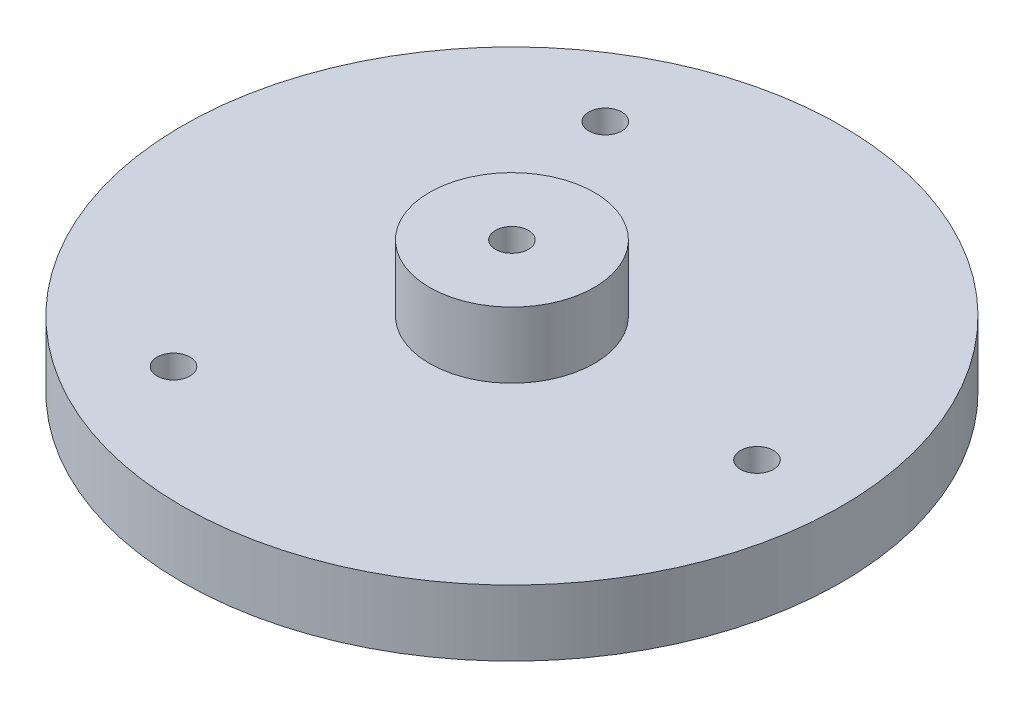
ISO-10303-21;
HEADER;
FILE_DESCRIPTION(('STEP AP214'),'2;1');
FILE_NAME('part.step','',(''),(''),'','','');
FILE_SCHEMA(('AUTOMOTIVE_DESIGN { 1 0 10303 214 1 1 1 1 }'));
ENDSEC;
DATA;
#1=APPLICATION_CONTEXT('core data for automotive mechanical design processes');
#2=APPLICATION_PROTOCOL_DEFINITION('international standard','automotive_design',2000,#1);
#3=PRODUCT_CONTEXT('',#1,'mechanical');
#4=PRODUCT('Part','Part','',(#3));
#5=PRODUCT_RELATED_PRODUCT_CATEGORY('part','',(#4));
#6=PRODUCT_DEFINITION_FORMATION('','',#4);
#7=PRODUCT_DEFINITION_CONTEXT('part definition',#1,'design');
#8=PRODUCT_DEFINITION('design','',#6,#7);
#9=PRODUCT_DEFINITION_SHAPE('','',#8);
#10=(LENGTH_UNIT() NAMED_UNIT(*) SI_UNIT(.MILLI.,.METRE.));
#11=(NAMED_UNIT(*) PLANE_ANGLE_UNIT() SI_UNIT($,.RADIAN.));
#12=(NAMED_UNIT(*) SI_UNIT($,.STERADIAN.) SOLID_ANGLE_UNIT());
#13=UNCERTAINTY_MEASURE_WITH_UNIT(LENGTH_MEASURE(1.E-05),#10,'distance_accuracy_value','');
#14=(GEOMETRIC_REPRESENTATION_CONTEXT(3) GLOBAL_UNCERTAINTY_ASSIGNED_CONTEXT((#13)) GLOBAL_UNIT_ASSIGNED_CONTEXT((#10,
#11,#12)) REPRESENTATION_CONTEXT('',''));
#15=CARTESIAN_POINT('',(0.,0.,0.));
#16=DIRECTION('',(0.,0.,1.));
#17=DIRECTION('',(1.,0.,0.));
#18=AXIS2_PLACEMENT_3D('',#15,#16,#17);
#19=CARTESIAN_POINT('',(0.,20.,0.));
#20=DIRECTION('',(0.,-1.,0.));
#21=DIRECTION('',(0.,0.,-1.));
#22=AXIS2_PLACEMENT_3D('',#19,#20,#21);
#23=CYLINDRICAL_SURFACE('',#22,100.);
#24=CARTESIAN_POINT('',(0.,20.,0.));
#25=DIRECTION('',(0.,1.,0.));
#26=DIRECTION('',(0.,0.,1.));
#27=AXIS2_PLACEMENT_3D('',#24,#25,#26);
#28=CIRCLE('',#27,100.);
#29=CARTESIAN_POINT('',(0.,20.,100.));
#30=VERTEX_POINT('',#29);
#31=EDGE_CURVE('E44',#30,#30,#28,.T.);
#32=ORIENTED_EDGE('',*,*,#31,.F.);
#33=EDGE_LOOP('',(#32));
#34=FACE_BOUND('',#33,.T.);
#35=CARTESIAN_POINT('',(0.,0.,0.));
#36=DIRECTION('',(0.,1.,0.));
#37=DIRECTION('',(0.,0.,1.));
#38=AXIS2_PLACEMENT_3D('',#35,#36,#37);
#39=CIRCLE('',#38,100.);
#40=CARTESIAN_POINT('',(0.,0.,100.));
#41=VERTEX_POINT('',#40);
#42=EDGE_CURVE('E40',#41,#41,#39,.T.);
#43=ORIENTED_EDGE('',*,*,#42,.T.);
#44=EDGE_LOOP('',(#43));
#45=FACE_BOUND('',#44,.T.);
#46=ADVANCED_FACE('F36',(#34,#45),#23,.T.);
#47=CARTESIAN_POINT('',(-38.0555535784994,20.,64.6279725957233));
#48=DIRECTION('',(0.,-1.,0.));
#49=DIRECTION('',(0.,0.,-1.));
#50=AXIS2_PLACEMENT_3D('',#47,#48,#49);
#51=CYLINDRICAL_SURFACE('',#50,5.00000000000475);
#52=CARTESIAN_POINT('',(-38.0555535784994,20.,64.6279725957233));
#53=DIRECTION('',(0.,1.,0.));
#54=DIRECTION('',(0.,0.,1.));
#55=AXIS2_PLACEMENT_3D('',#52,#53,#54);
#56=CIRCLE('',#55,5.00000000000475);
#57=CARTESIAN_POINT('',(-38.0555535784994,20.,69.6279725957281));
#58=VERTEX_POINT('',#57);
#59=EDGE_CURVE('E49',#58,#58,#56,.T.);
#60=ORIENTED_EDGE('',*,*,#59,.T.);
#61=EDGE_LOOP('',(#60));
#62=FACE_BOUND('',#61,.T.);
#63=CARTESIAN_POINT('',(-38.0555535784994,0.,64.6279725957233));
#64=DIRECTION('',(0.,1.,0.));
#65=DIRECTION('',(0.,0.,1.));
#66=AXIS2_PLACEMENT_3D('',#63,#64,#65);
#67=CIRCLE('',#66,5.00000000000475);
#68=CARTESIAN_POINT('',(-38.0555535784994,0.,69.6279725957281));
#69=VERTEX_POINT('',#68);
#70=EDGE_CURVE('E59',#69,#69,#67,.T.);
#71=ORIENTED_EDGE('',*,*,#70,.F.);
#72=EDGE_LOOP('',(#71));
#73=FACE_BOUND('',#72,.T.);
#74=ADVANCED_FACE('F80',(#62,#73),#51,.F.);
#75=CARTESIAN_POINT('',(74.997242852236,20.,0.643089856198714));
#76=DIRECTION('',(0.,-1.,0.));
#77=DIRECTION('',(0.,0.,-1.));
#78=AXIS2_PLACEMENT_3D('',#75,#76,#77);
#79=CYLINDRICAL_SURFACE('',#78,5.00000000000553);
#80=CARTESIAN_POINT('',(74.997242852236,20.,0.643089856198714));
#81=DIRECTION('',(0.,1.,0.));
#82=DIRECTION('',(0.,0.,1.));
#83=AXIS2_PLACEMENT_3D('',#80,#81,#82);
#84=CIRCLE('',#83,5.00000000000553);
#85=CARTESIAN_POINT('',(74.997242852236,20.,5.64308985620424));
#86=VERTEX_POINT('',#85);
#87=EDGE_CURVE('E68',#86,#86,#84,.T.);
#88=ORIENTED_EDGE('',*,*,#87,.T.);
#89=EDGE_LOOP('',(#88));
#90=FACE_BOUND('',#89,.T.);
#91=CARTESIAN_POINT('',(74.997242852236,0.,0.643089856198714));
#92=DIRECTION('',(0.,1.,0.));
#93=DIRECTION('',(0.,0.,1.));
#94=AXIS2_PLACEMENT_3D('',#91,#92,#93);
#95=CIRCLE('',#94,5.00000000000553);
#96=CARTESIAN_POINT('',(74.997242852236,0.,5.64308985620424));
#97=VERTEX_POINT('',#96);
#98=EDGE_CURVE('E56',#97,#97,#95,.T.);
#99=ORIENTED_EDGE('',*,*,#98,.F.);
#100=EDGE_LOOP('',(#99));
#101=FACE_BOUND('',#100,.T.);
#102=ADVANCED_FACE('F97',(#90,#101),#79,.F.);
#103=CARTESIAN_POINT('',(-36.9416892737284,20.,-65.2710624519266));
#104=DIRECTION('',(0.,-1.,0.));
#105=DIRECTION('',(0.,0.,-1.));
#106=AXIS2_PLACEMENT_3D('',#103,#104,#105);
#107=CYLINDRICAL_SURFACE('',#106,5.);
#108=CARTESIAN_POINT('',(-36.9416892737284,20.,-65.2710624519266));
#109=DIRECTION('',(0.,1.,0.));
#110=DIRECTION('',(0.,0.,1.));
#111=AXIS2_PLACEMENT_3D('',#108,#109,#110);
#112=CIRCLE('',#111,5.);
#113=CARTESIAN_POINT('',(-36.9416892737284,20.,-60.2710624519266));
#114=VERTEX_POINT('',#113);
#115=EDGE_CURVE('E64',#114,#114,#112,.T.);
#116=ORIENTED_EDGE('',*,*,#115,.T.);
#117=EDGE_LOOP('',(#116));
#118=FACE_BOUND('',#117,.T.);
#119=CARTESIAN_POINT('',(-36.9416892737284,0.,-65.2710624519266));
#120=DIRECTION('',(0.,1.,0.));
#121=DIRECTION('',(0.,0.,1.));
#122=AXIS2_PLACEMENT_3D('',#119,#120,#121);
#123=CIRCLE('',#122,5.);
#124=CARTESIAN_POINT('',(-36.9416892737284,0.,-60.2710624519266));
#125=VERTEX_POINT('',#124);
#126=EDGE_CURVE('E53',#125,#125,#123,.T.);
#127=ORIENTED_EDGE('',*,*,#126,.F.);
#128=EDGE_LOOP('',(#127));
#129=FACE_BOUND('',#128,.T.);
#130=ADVANCED_FACE('F38',(#118,#129),#107,.F.);
#131=CARTESIAN_POINT('',(0.,20.,0.));
#132=DIRECTION('',(0.,1.,0.));
#133=DIRECTION('',(0.,0.,1.));
#134=AXIS2_PLACEMENT_3D('',#131,#132,#133);
#135=PLANE('',#134);
#136=ORIENTED_EDGE('',*,*,#115,.F.);
#137=EDGE_LOOP('',(#136));
#138=FACE_BOUND('',#137,.T.);
#139=ORIENTED_EDGE('',*,*,#87,.F.);
#140=EDGE_LOOP('',(#139));
#141=FACE_BOUND('',#140,.T.);
#142=ORIENTED_EDGE('',*,*,#59,.F.);
#143=EDGE_LOOP('',(#142));
#144=FACE_BOUND('',#143,.T.);
#145=ORIENTED_EDGE('',*,*,#31,.T.);
#146=EDGE_LOOP('',(#145));
#147=FACE_BOUND('',#146,.T.);
#148=CARTESIAN_POINT('',(0.,20.,0.));
#149=DIRECTION('',(0.,1.,0.));
#150=DIRECTION('',(0.,0.,1.));
#151=AXIS2_PLACEMENT_3D('',#148,#149,#150);
#152=CIRCLE('',#151,25.);
#153=CARTESIAN_POINT('',(0.,20.,25.));
#154=VERTEX_POINT('',#153);
#155=EDGE_CURVE('E10',#154,#154,#152,.T.);
#156=ORIENTED_EDGE('',*,*,#155,.F.);
#157=EDGE_LOOP('',(#156));
#158=FACE_BOUND('',#157,.T.);
#159=ADVANCED_FACE('F83',(#138,#141,#144,#147,#158),#135,.T.);
#160=CARTESIAN_POINT('',(0.,0.,0.));
#161=DIRECTION('',(0.,1.,0.));
#162=DIRECTION('',(0.,0.,1.));
#163=AXIS2_PLACEMENT_3D('',#160,#161,#162);
#164=PLANE('',#163);
#165=ORIENTED_EDGE('',*,*,#126,.T.);
#166=EDGE_LOOP('',(#165));
#167=FACE_BOUND('',#166,.T.);
#168=ORIENTED_EDGE('',*,*,#98,.T.);
#169=EDGE_LOOP('',(#168));
#170=FACE_BOUND('',#169,.T.);
#171=ORIENTED_EDGE('',*,*,#70,.T.);
#172=EDGE_LOOP('',(#171));
#173=FACE_BOUND('',#172,.T.);
#174=ORIENTED_EDGE('',*,*,#42,.F.);
#175=EDGE_LOOP('',(#174));
#176=FACE_BOUND('',#175,.T.);
#177=CARTESIAN_POINT('',(0.,0.,0.));
#178=DIRECTION('',(0.,1.,0.));
#179=DIRECTION('',(0.,0.,1.));
#180=AXIS2_PLACEMENT_3D('',#177,#178,#179);
#181=CIRCLE('',#180,5.);
#182=CARTESIAN_POINT('',(0.,0.,5.));
#183=VERTEX_POINT('',#182);
#184=EDGE_CURVE('E75',#183,#183,#181,.T.);
#185=ORIENTED_EDGE('',*,*,#184,.T.);
#186=EDGE_LOOP('',(#185));
#187=FACE_BOUND('',#186,.T.);
#188=ADVANCED_FACE('F86',(#167,#170,#173,#176,#187),#164,.F.);
#189=CARTESIAN_POINT('',(0.,40.,0.));
#190=DIRECTION('',(0.,-1.,0.));
#191=DIRECTION('',(0.,0.,-1.));
#192=AXIS2_PLACEMENT_3D('',#189,#190,#191);
#193=CYLINDRICAL_SURFACE('',#192,5.);
#194=CARTESIAN_POINT('',(0.,40.,0.));
#195=DIRECTION('',(0.,1.,0.));
#196=DIRECTION('',(0.,0.,1.));
#197=AXIS2_PLACEMENT_3D('',#194,#195,#196);
#198=CIRCLE('',#197,5.);
#199=CARTESIAN_POINT('',(0.,40.,5.));
#200=VERTEX_POINT('',#199);
#201=EDGE_CURVE('E117',#200,#200,#198,.T.);
#202=ORIENTED_EDGE('',*,*,#201,.T.);
#203=EDGE_LOOP('',(#202));
#204=FACE_BOUND('',#203,.T.);
#205=ORIENTED_EDGE('',*,*,#184,.F.);
#206=EDGE_LOOP('',(#205));
#207=FACE_BOUND('',#206,.T.);
#208=ADVANCED_FACE('F110',(#204,#207),#193,.F.);
#209=CARTESIAN_POINT('',(0.,40.,0.));
#210=DIRECTION('',(0.,-1.,0.));
#211=DIRECTION('',(0.,0.,-1.));
#212=AXIS2_PLACEMENT_3D('',#209,#210,#211);
#213=CYLINDRICAL_SURFACE('',#212,25.);
#214=ORIENTED_EDGE('',*,*,#155,.T.);
#215=EDGE_LOOP('',(#214));
#216=FACE_BOUND('',#215,.T.);
#217=CARTESIAN_POINT('',(0.,40.,0.));
#218=DIRECTION('',(0.,1.,0.));
#219=DIRECTION('',(0.,0.,1.));
#220=AXIS2_PLACEMENT_3D('',#217,#218,#219);
#221=CIRCLE('',#220,25.);
#222=CARTESIAN_POINT('',(0.,40.,25.));
#223=VERTEX_POINT('',#222);
#224=EDGE_CURVE('E57',#223,#223,#221,.T.);
#225=ORIENTED_EDGE('',*,*,#224,.F.);
#226=EDGE_LOOP('',(#225));
#227=FACE_BOUND('',#226,.T.);
#228=ADVANCED_FACE('F127',(#216,#227),#213,.T.);
#229=CARTESIAN_POINT('',(0.,40.,0.));
#230=DIRECTION('',(0.,1.,0.));
#231=DIRECTION('',(0.,0.,1.));
#232=AXIS2_PLACEMENT_3D('',#229,#230,#231);
#233=PLANE('',#232);
#234=ORIENTED_EDGE('',*,*,#201,.F.);
#235=EDGE_LOOP('',(#234));
#236=FACE_BOUND('',#235,.T.);
#237=ORIENTED_EDGE('',*,*,#224,.T.);
#238=EDGE_LOOP('',(#237));
#239=FACE_BOUND('',#238,.T.);
#240=ADVANCED_FACE('F125',(#236,#239),#233,.T.);
#241=CLOSED_SHELL('',(#46,#74,#102,#130,#159,#188,#208,#228,#240));
#242=MANIFOLD_SOLID_BREP('B2',#241);
#243=ADVANCED_BREP_SHAPE_REPRESENTATION('',(#18,#242),#14);
#244=SHAPE_DEFINITION_REPRESENTATION(#9,#243);
ENDSEC;
END-ISO-10303-21;
